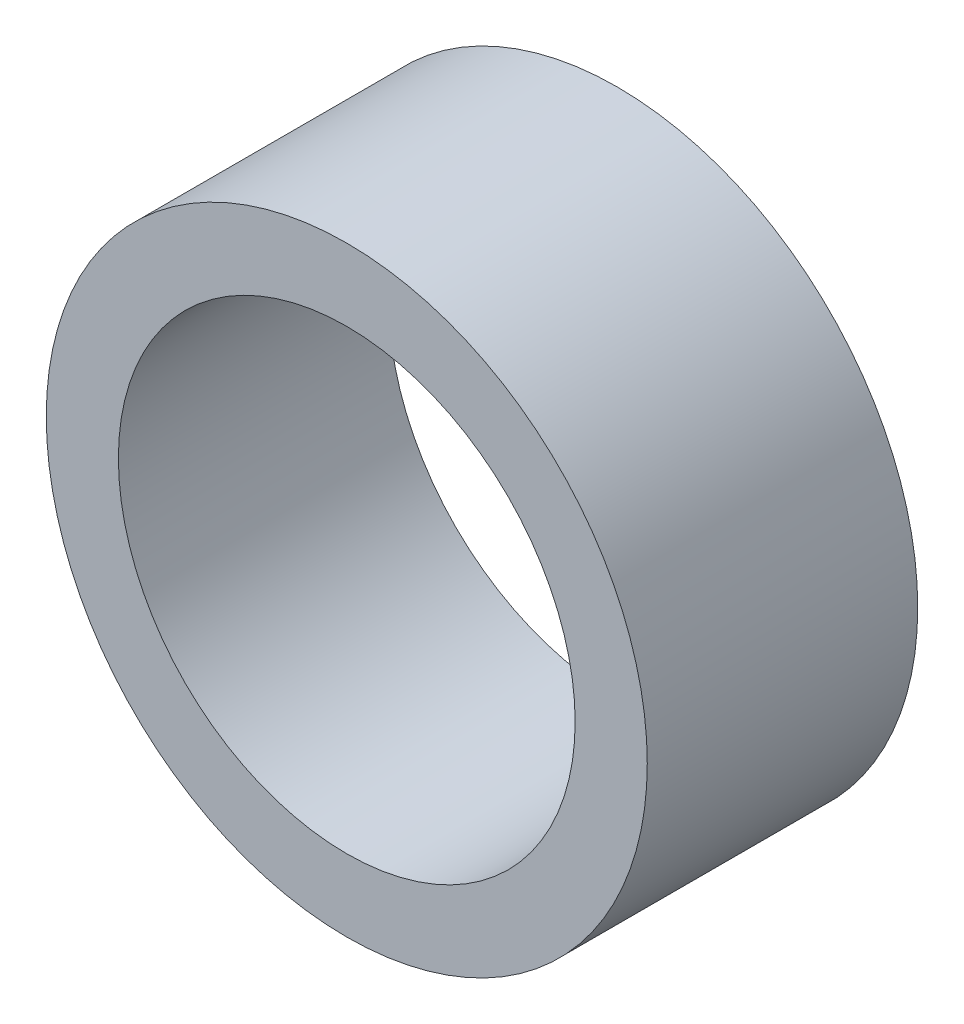
ISO-10303-21;
HEADER;
FILE_DESCRIPTION(('STEP AP214'),'2;1');
FILE_NAME('part.step','',(''),(''),'','','');
FILE_SCHEMA(('AUTOMOTIVE_DESIGN { 1 0 10303 214 1 1 1 1 }'));
ENDSEC;
DATA;
#1=APPLICATION_CONTEXT('core data for automotive mechanical design processes');
#2=APPLICATION_PROTOCOL_DEFINITION('international standard','automotive_design',2000,#1);
#3=PRODUCT_CONTEXT('',#1,'mechanical');
#4=PRODUCT('Part','Part','',(#3));
#5=PRODUCT_RELATED_PRODUCT_CATEGORY('part','',(#4));
#6=PRODUCT_DEFINITION_FORMATION('','',#4);
#7=PRODUCT_DEFINITION_CONTEXT('part definition',#1,'design');
#8=PRODUCT_DEFINITION('design','',#6,#7);
#9=PRODUCT_DEFINITION_SHAPE('','',#8);
#10=(LENGTH_UNIT() NAMED_UNIT(*) SI_UNIT(.MILLI.,.METRE.));
#11=(NAMED_UNIT(*) PLANE_ANGLE_UNIT() SI_UNIT($,.RADIAN.));
#12=(NAMED_UNIT(*) SI_UNIT($,.STERADIAN.) SOLID_ANGLE_UNIT());
#13=UNCERTAINTY_MEASURE_WITH_UNIT(LENGTH_MEASURE(1.E-05),#10,'distance_accuracy_value','');
#14=(GEOMETRIC_REPRESENTATION_CONTEXT(3) GLOBAL_UNCERTAINTY_ASSIGNED_CONTEXT((#13)) GLOBAL_UNIT_ASSIGNED_CONTEXT((#10,
#11,#12)) REPRESENTATION_CONTEXT('',''));
#15=CARTESIAN_POINT('',(0.,0.,0.));
#16=DIRECTION('',(0.,0.,1.));
#17=DIRECTION('',(1.,0.,0.));
#18=AXIS2_PLACEMENT_3D('',#15,#16,#17);
#19=CARTESIAN_POINT('',(0.,0.,4.5));
#20=DIRECTION('',(0.,0.,1.));
#21=DIRECTION('',(1.,0.,0.));
#22=AXIS2_PLACEMENT_3D('',#19,#20,#21);
#23=PLANE('',#22);
#24=CARTESIAN_POINT('',(0.,0.,4.5));
#25=DIRECTION('',(0.,0.,1.));
#26=DIRECTION('',(1.,0.,0.));
#27=AXIS2_PLACEMENT_3D('',#24,#25,#26);
#28=CIRCLE('',#27,10.);
#29=CARTESIAN_POINT('',(10.,0.,4.5));
#30=VERTEX_POINT('',#29);
#31=EDGE_CURVE('E10',#30,#30,#28,.T.);
#32=ORIENTED_EDGE('',*,*,#31,.T.);
#33=EDGE_LOOP('',(#32));
#34=FACE_BOUND('',#33,.T.);
#35=CARTESIAN_POINT('',(0.,0.,4.5));
#36=DIRECTION('',(0.,0.,1.));
#37=DIRECTION('',(1.,0.,0.));
#38=AXIS2_PLACEMENT_3D('',#35,#36,#37);
#39=CIRCLE('',#38,7.6);
#40=CARTESIAN_POINT('',(7.6,0.,4.5));
#41=VERTEX_POINT('',#40);
#42=EDGE_CURVE('E54',#41,#41,#39,.T.);
#43=ORIENTED_EDGE('',*,*,#42,.F.);
#44=EDGE_LOOP('',(#43));
#45=FACE_BOUND('',#44,.T.);
#46=ADVANCED_FACE('F41',(#34,#45),#23,.T.);
#47=CARTESIAN_POINT('',(0.,0.,-4.5));
#48=DIRECTION('',(0.,0.,1.));
#49=DIRECTION('',(1.,0.,0.));
#50=AXIS2_PLACEMENT_3D('',#47,#48,#49);
#51=PLANE('',#50);
#52=CARTESIAN_POINT('',(0.,0.,-4.5));
#53=DIRECTION('',(0.,0.,1.));
#54=DIRECTION('',(1.,0.,0.));
#55=AXIS2_PLACEMENT_3D('',#52,#53,#54);
#56=CIRCLE('',#55,10.);
#57=CARTESIAN_POINT('',(10.,0.,-4.5));
#58=VERTEX_POINT('',#57);
#59=EDGE_CURVE('E45',#58,#58,#56,.T.);
#60=ORIENTED_EDGE('',*,*,#59,.F.);
#61=EDGE_LOOP('',(#60));
#62=FACE_BOUND('',#61,.T.);
#63=CARTESIAN_POINT('',(0.,0.,-4.5));
#64=DIRECTION('',(0.,0.,1.));
#65=DIRECTION('',(1.,0.,0.));
#66=AXIS2_PLACEMENT_3D('',#63,#64,#65);
#67=CIRCLE('',#66,7.6);
#68=CARTESIAN_POINT('',(7.6,0.,-4.5));
#69=VERTEX_POINT('',#68);
#70=EDGE_CURVE('E56',#69,#69,#67,.T.);
#71=ORIENTED_EDGE('',*,*,#70,.T.);
#72=EDGE_LOOP('',(#71));
#73=FACE_BOUND('',#72,.T.);
#74=ADVANCED_FACE('F68',(#62,#73),#51,.F.);
#75=CARTESIAN_POINT('',(0.,0.,4.5));
#76=DIRECTION('',(0.,0.,-1.));
#77=DIRECTION('',(-1.,0.,0.));
#78=AXIS2_PLACEMENT_3D('',#75,#76,#77);
#79=CYLINDRICAL_SURFACE('',#78,10.);
#80=ORIENTED_EDGE('',*,*,#31,.F.);
#81=EDGE_LOOP('',(#80));
#82=FACE_BOUND('',#81,.T.);
#83=ORIENTED_EDGE('',*,*,#59,.T.);
#84=EDGE_LOOP('',(#83));
#85=FACE_BOUND('',#84,.T.);
#86=ADVANCED_FACE('F43',(#82,#85),#79,.T.);
#87=CARTESIAN_POINT('',(0.,0.,4.5));
#88=DIRECTION('',(0.,0.,-1.));
#89=DIRECTION('',(-1.,0.,0.));
#90=AXIS2_PLACEMENT_3D('',#87,#88,#89);
#91=CYLINDRICAL_SURFACE('',#90,7.6);
#92=ORIENTED_EDGE('',*,*,#42,.T.);
#93=EDGE_LOOP('',(#92));
#94=FACE_BOUND('',#93,.T.);
#95=ORIENTED_EDGE('',*,*,#70,.F.);
#96=EDGE_LOOP('',(#95));
#97=FACE_BOUND('',#96,.T.);
#98=ADVANCED_FACE('F64',(#94,#97),#91,.F.);
#99=CLOSED_SHELL('',(#46,#74,#86,#98));
#100=MANIFOLD_SOLID_BREP('B2',#99);
#101=ADVANCED_BREP_SHAPE_REPRESENTATION('',(#18,#100),#14);
#102=SHAPE_DEFINITION_REPRESENTATION(#9,#101);
ENDSEC;
END-ISO-10303-21;
